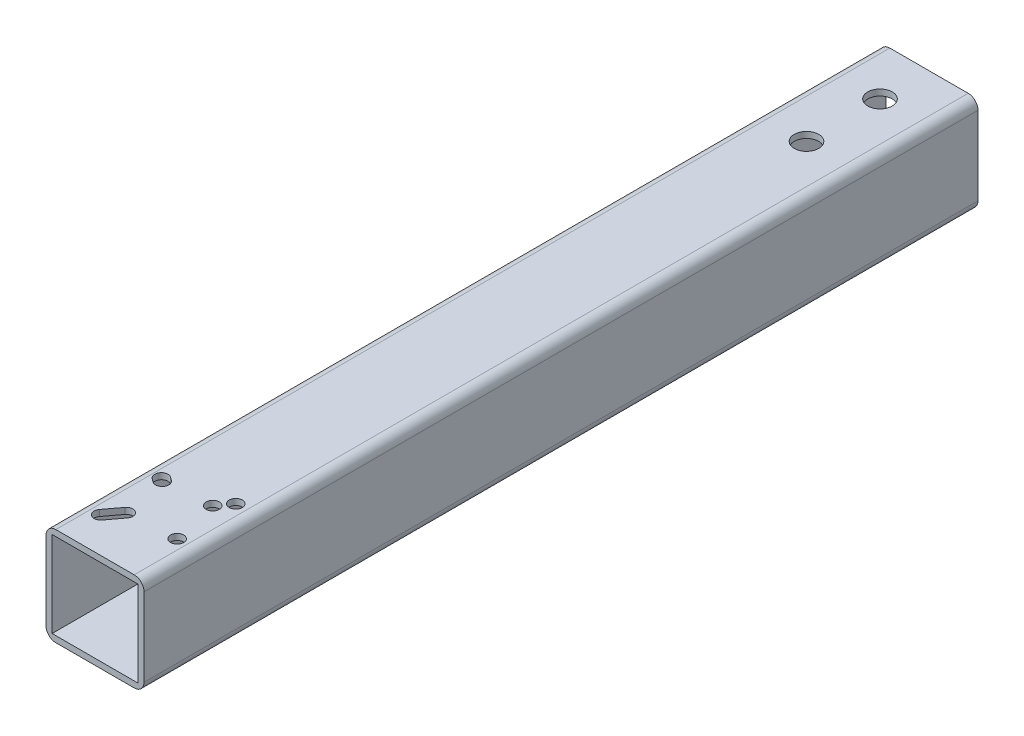
ISO-10303-21;
HEADER;
FILE_DESCRIPTION(('STEP AP214'),'2;1');
FILE_NAME('part.step','',(''),(''),'','','');
FILE_SCHEMA(('AUTOMOTIVE_DESIGN { 1 0 10303 214 1 1 1 1 }'));
ENDSEC;
DATA;
#1=APPLICATION_CONTEXT('core data for automotive mechanical design processes');
#2=APPLICATION_PROTOCOL_DEFINITION('international standard','automotive_design',2000,#1);
#3=PRODUCT_CONTEXT('',#1,'mechanical');
#4=PRODUCT('Part','Part','',(#3));
#5=PRODUCT_RELATED_PRODUCT_CATEGORY('part','',(#4));
#6=PRODUCT_DEFINITION_FORMATION('','',#4);
#7=PRODUCT_DEFINITION_CONTEXT('part definition',#1,'design');
#8=PRODUCT_DEFINITION('design','',#6,#7);
#9=PRODUCT_DEFINITION_SHAPE('','',#8);
#10=(LENGTH_UNIT() NAMED_UNIT(*) SI_UNIT(.MILLI.,.METRE.));
#11=(NAMED_UNIT(*) PLANE_ANGLE_UNIT() SI_UNIT($,.RADIAN.));
#12=(NAMED_UNIT(*) SI_UNIT($,.STERADIAN.) SOLID_ANGLE_UNIT());
#13=UNCERTAINTY_MEASURE_WITH_UNIT(LENGTH_MEASURE(1.E-05),#10,'distance_accuracy_value','');
#14=(GEOMETRIC_REPRESENTATION_CONTEXT(3) GLOBAL_UNCERTAINTY_ASSIGNED_CONTEXT((#13)) GLOBAL_UNIT_ASSIGNED_CONTEXT((#10,
#11,#12)) REPRESENTATION_CONTEXT('',''));
#15=CARTESIAN_POINT('',(0.,0.,0.));
#16=DIRECTION('',(0.,0.,1.));
#17=DIRECTION('',(1.,0.,0.));
#18=AXIS2_PLACEMENT_3D('',#15,#16,#17);
#19=CARTESIAN_POINT('',(0.,0.,216.154));
#20=DIRECTION('',(0.,0.,1.));
#21=DIRECTION('',(1.,0.,0.));
#22=AXIS2_PLACEMENT_3D('',#19,#20,#21);
#23=PLANE('',#22);
#24=DIRECTION('',(1.,0.,0.));
#25=VECTOR('',#24,1.);
#26=CARTESIAN_POINT('',(-24.2595918367347,-13.9751836734694,216.154));
#27=LINE('',#26,#25);
#28=CARTESIAN_POINT('',(-21.7195918367347,-13.9751836734694,216.154));
#29=VERTEX_POINT('',#28);
#30=CARTESIAN_POINT('',(-1.39959183673471,-13.9751836734694,216.154));
#31=VERTEX_POINT('',#30);
#32=EDGE_CURVE('E282',#29,#31,#27,.T.);
#33=ORIENTED_EDGE('',*,*,#32,.T.);
#34=CARTESIAN_POINT('',(-1.3995918367347,-11.4351836734694,216.154));
#35=DIRECTION('',(0.,0.,1.));
#36=DIRECTION('',(1.,0.,0.));
#37=AXIS2_PLACEMENT_3D('',#34,#35,#36);
#38=CIRCLE('',#37,2.54);
#39=CARTESIAN_POINT('',(1.1404081632653,-11.4351836734694,216.154));
#40=VERTEX_POINT('',#39);
#41=EDGE_CURVE('E326',#31,#40,#38,.T.);
#42=ORIENTED_EDGE('',*,*,#41,.T.);
#43=DIRECTION('',(0.,1.,0.));
#44=VECTOR('',#43,1.);
#45=CARTESIAN_POINT('',(1.1404081632653,11.4248163265306,216.154));
#46=LINE('',#45,#44);
#47=CARTESIAN_POINT('',(1.1404081632653,8.88481632653061,216.154));
#48=VERTEX_POINT('',#47);
#49=EDGE_CURVE('E286',#40,#48,#46,.T.);
#50=ORIENTED_EDGE('',*,*,#49,.T.);
#51=CARTESIAN_POINT('',(-1.39959183673471,8.88481632653061,216.154));
#52=DIRECTION('',(0.,0.,1.));
#53=DIRECTION('',(1.,0.,0.));
#54=AXIS2_PLACEMENT_3D('',#51,#52,#53);
#55=CIRCLE('',#54,2.54);
#56=CARTESIAN_POINT('',(-1.39959183673471,11.4248163265306,216.154));
#57=VERTEX_POINT('',#56);
#58=EDGE_CURVE('E320',#48,#57,#55,.T.);
#59=ORIENTED_EDGE('',*,*,#58,.T.);
#60=DIRECTION('',(-1.,0.,0.));
#61=VECTOR('',#60,1.);
#62=CARTESIAN_POINT('',(-24.2595918367347,11.4248163265306,216.154));
#63=LINE('',#62,#61);
#64=CARTESIAN_POINT('',(-21.7195918367347,11.4248163265306,216.154));
#65=VERTEX_POINT('',#64);
#66=EDGE_CURVE('E289',#57,#65,#63,.T.);
#67=ORIENTED_EDGE('',*,*,#66,.T.);
#68=CARTESIAN_POINT('',(-21.7195918367347,8.88481632653061,216.154));
#69=DIRECTION('',(0.,0.,1.));
#70=DIRECTION('',(1.,0.,0.));
#71=AXIS2_PLACEMENT_3D('',#68,#69,#70);
#72=CIRCLE('',#71,2.54);
#73=CARTESIAN_POINT('',(-24.2595918367347,8.88481632653061,216.154));
#74=VERTEX_POINT('',#73);
#75=EDGE_CURVE('E322',#65,#74,#72,.T.);
#76=ORIENTED_EDGE('',*,*,#75,.T.);
#77=DIRECTION('',(0.,-1.,0.));
#78=VECTOR('',#77,1.);
#79=CARTESIAN_POINT('',(-24.2595918367347,11.4248163265306,216.154));
#80=LINE('',#79,#78);
#81=CARTESIAN_POINT('',(-24.2595918367347,-11.4351836734694,216.154));
#82=VERTEX_POINT('',#81);
#83=EDGE_CURVE('E279',#74,#82,#80,.T.);
#84=ORIENTED_EDGE('',*,*,#83,.T.);
#85=CARTESIAN_POINT('',(-21.7195918367347,-11.4351836734694,216.154));
#86=DIRECTION('',(0.,0.,1.));
#87=DIRECTION('',(1.,0.,0.));
#88=AXIS2_PLACEMENT_3D('',#85,#86,#87);
#89=CIRCLE('',#88,2.54);
#90=EDGE_CURVE('E324',#82,#29,#89,.T.);
#91=ORIENTED_EDGE('',*,*,#90,.T.);
#92=EDGE_LOOP('',(#33,#42,#50,#59,#67,#76,#84,#91));
#93=FACE_BOUND('',#92,.T.);
#94=DIRECTION('',(1.,0.,0.));
#95=VECTOR('',#94,1.);
#96=CARTESIAN_POINT('',(-22.6720918367347,-12.3876836734694,216.154));
#97=LINE('',#96,#95);
#98=CARTESIAN_POINT('',(-22.6720918367347,-12.3876836734694,216.154));
#99=VERTEX_POINT('',#98);
#100=CARTESIAN_POINT('',(-0.447091836734699,-12.3876836734694,216.154));
#101=VERTEX_POINT('',#100);
#102=EDGE_CURVE('E250',#99,#101,#97,.T.);
#103=ORIENTED_EDGE('',*,*,#102,.F.);
#104=DIRECTION('',(0.,-1.,0.));
#105=VECTOR('',#104,1.);
#106=CARTESIAN_POINT('',(-22.6720918367347,9.83731632653061,216.154));
#107=LINE('',#106,#105);
#108=CARTESIAN_POINT('',(-22.6720918367347,9.83731632653061,216.154));
#109=VERTEX_POINT('',#108);
#110=EDGE_CURVE('E248',#109,#99,#107,.T.);
#111=ORIENTED_EDGE('',*,*,#110,.F.);
#112=DIRECTION('',(-1.,0.,0.));
#113=VECTOR('',#112,1.);
#114=CARTESIAN_POINT('',(-22.6720918367347,9.83731632653061,216.154));
#115=LINE('',#114,#113);
#116=CARTESIAN_POINT('',(-0.447091836734703,9.83731632653061,216.154));
#117=VERTEX_POINT('',#116);
#118=EDGE_CURVE('E256',#117,#109,#115,.T.);
#119=ORIENTED_EDGE('',*,*,#118,.F.);
#120=DIRECTION('',(0.,1.,0.));
#121=VECTOR('',#120,1.);
#122=CARTESIAN_POINT('',(-0.447091836734703,9.83731632653061,216.154));
#123=LINE('',#122,#121);
#124=EDGE_CURVE('E253',#101,#117,#123,.T.);
#125=ORIENTED_EDGE('',*,*,#124,.F.);
#126=EDGE_LOOP('',(#103,#111,#119,#125));
#127=FACE_BOUND('',#126,.T.);
#128=ADVANCED_FACE('F33',(#93,#127),#23,.T.);
#129=CARTESIAN_POINT('',(0.,0.,0.));
#130=DIRECTION('',(0.,0.,1.));
#131=DIRECTION('',(1.,0.,0.));
#132=AXIS2_PLACEMENT_3D('',#129,#130,#131);
#133=PLANE('',#132);
#134=DIRECTION('',(0.,1.,0.));
#135=VECTOR('',#134,1.);
#136=CARTESIAN_POINT('',(1.1404081632653,11.4248163265306,0.));
#137=LINE('',#136,#135);
#138=CARTESIAN_POINT('',(1.1404081632653,-11.4351836734694,0.));
#139=VERTEX_POINT('',#138);
#140=CARTESIAN_POINT('',(1.1404081632653,8.88481632653061,0.));
#141=VERTEX_POINT('',#140);
#142=EDGE_CURVE('E298',#139,#141,#137,.T.);
#143=ORIENTED_EDGE('',*,*,#142,.F.);
#144=CARTESIAN_POINT('',(-1.3995918367347,-11.4351836734694,0.));
#145=DIRECTION('',(0.,0.,1.));
#146=DIRECTION('',(1.,0.,0.));
#147=AXIS2_PLACEMENT_3D('',#144,#145,#146);
#148=CIRCLE('',#147,2.54);
#149=CARTESIAN_POINT('',(-1.39959183673471,-13.9751836734694,0.));
#150=VERTEX_POINT('',#149);
#151=EDGE_CURVE('E313',#139,#150,#148,.F.);
#152=ORIENTED_EDGE('',*,*,#151,.T.);
#153=DIRECTION('',(1.,0.,0.));
#154=VECTOR('',#153,1.);
#155=CARTESIAN_POINT('',(-24.2595918367347,-13.9751836734694,0.));
#156=LINE('',#155,#154);
#157=CARTESIAN_POINT('',(-21.7195918367347,-13.9751836734694,0.));
#158=VERTEX_POINT('',#157);
#159=EDGE_CURVE('E295',#158,#150,#156,.T.);
#160=ORIENTED_EDGE('',*,*,#159,.F.);
#161=CARTESIAN_POINT('',(-21.7195918367347,-11.4351836734694,0.));
#162=DIRECTION('',(0.,0.,1.));
#163=DIRECTION('',(1.,0.,0.));
#164=AXIS2_PLACEMENT_3D('',#161,#162,#163);
#165=CIRCLE('',#164,2.54);
#166=CARTESIAN_POINT('',(-24.2595918367347,-11.4351836734694,0.));
#167=VERTEX_POINT('',#166);
#168=EDGE_CURVE('E311',#158,#167,#165,.F.);
#169=ORIENTED_EDGE('',*,*,#168,.T.);
#170=DIRECTION('',(0.,-1.,0.));
#171=VECTOR('',#170,1.);
#172=CARTESIAN_POINT('',(-24.2595918367347,11.4248163265306,0.));
#173=LINE('',#172,#171);
#174=CARTESIAN_POINT('',(-24.2595918367347,8.88481632653061,0.));
#175=VERTEX_POINT('',#174);
#176=EDGE_CURVE('E278',#175,#167,#173,.T.);
#177=ORIENTED_EDGE('',*,*,#176,.F.);
#178=CARTESIAN_POINT('',(-21.7195918367347,8.88481632653061,0.));
#179=DIRECTION('',(0.,0.,1.));
#180=DIRECTION('',(1.,0.,0.));
#181=AXIS2_PLACEMENT_3D('',#178,#179,#180);
#182=CIRCLE('',#181,2.54);
#183=CARTESIAN_POINT('',(-21.7195918367347,11.4248163265306,0.));
#184=VERTEX_POINT('',#183);
#185=EDGE_CURVE('E309',#175,#184,#182,.F.);
#186=ORIENTED_EDGE('',*,*,#185,.T.);
#187=DIRECTION('',(-1.,0.,0.));
#188=VECTOR('',#187,1.);
#189=CARTESIAN_POINT('',(-24.2595918367347,11.4248163265306,0.));
#190=LINE('',#189,#188);
#191=CARTESIAN_POINT('',(-1.39959183673471,11.4248163265306,0.));
#192=VERTEX_POINT('',#191);
#193=EDGE_CURVE('E283',#192,#184,#190,.T.);
#194=ORIENTED_EDGE('',*,*,#193,.F.);
#195=CARTESIAN_POINT('',(-1.39959183673471,8.88481632653061,0.));
#196=DIRECTION('',(0.,0.,1.));
#197=DIRECTION('',(1.,0.,0.));
#198=AXIS2_PLACEMENT_3D('',#195,#196,#197);
#199=CIRCLE('',#198,2.54);
#200=EDGE_CURVE('E307',#192,#141,#199,.F.);
#201=ORIENTED_EDGE('',*,*,#200,.T.);
#202=EDGE_LOOP('',(#143,#152,#160,#169,#177,#186,#194,#201));
#203=FACE_BOUND('',#202,.T.);
#204=DIRECTION('',(0.,-1.,0.));
#205=VECTOR('',#204,1.);
#206=CARTESIAN_POINT('',(-22.6720918367347,9.83731632653061,0.));
#207=LINE('',#206,#205);
#208=CARTESIAN_POINT('',(-22.6720918367347,9.83731632653061,0.));
#209=VERTEX_POINT('',#208);
#210=CARTESIAN_POINT('',(-22.6720918367347,-12.3876836734694,0.));
#211=VERTEX_POINT('',#210);
#212=EDGE_CURVE('E247',#209,#211,#207,.T.);
#213=ORIENTED_EDGE('',*,*,#212,.T.);
#214=DIRECTION('',(1.,0.,0.));
#215=VECTOR('',#214,1.);
#216=CARTESIAN_POINT('',(-22.6720918367347,-12.3876836734694,0.));
#217=LINE('',#216,#215);
#218=CARTESIAN_POINT('',(-0.447091836734699,-12.3876836734694,0.));
#219=VERTEX_POINT('',#218);
#220=EDGE_CURVE('E261',#211,#219,#217,.T.);
#221=ORIENTED_EDGE('',*,*,#220,.T.);
#222=DIRECTION('',(0.,1.,0.));
#223=VECTOR('',#222,1.);
#224=CARTESIAN_POINT('',(-0.447091836734703,9.83731632653061,0.));
#225=LINE('',#224,#223);
#226=CARTESIAN_POINT('',(-0.447091836734703,9.83731632653061,0.));
#227=VERTEX_POINT('',#226);
#228=EDGE_CURVE('E264',#219,#227,#225,.T.);
#229=ORIENTED_EDGE('',*,*,#228,.T.);
#230=DIRECTION('',(-1.,0.,0.));
#231=VECTOR('',#230,1.);
#232=CARTESIAN_POINT('',(-22.6720918367347,9.83731632653061,0.));
#233=LINE('',#232,#231);
#234=EDGE_CURVE('E251',#227,#209,#233,.T.);
#235=ORIENTED_EDGE('',*,*,#234,.T.);
#236=EDGE_LOOP('',(#213,#221,#229,#235));
#237=FACE_BOUND('',#236,.T.);
#238=ADVANCED_FACE('F389',(#203,#237),#133,.F.);
#239=CARTESIAN_POINT('',(-24.2595918367347,11.4248163265306,216.154));
#240=DIRECTION('',(1.,0.,0.));
#241=DIRECTION('',(0.,0.,-1.));
#242=AXIS2_PLACEMENT_3D('',#239,#240,#241);
#243=PLANE('',#242);
#244=ORIENTED_EDGE('',*,*,#176,.T.);
#245=DIRECTION('',(0.,0.,-1.));
#246=VECTOR('',#245,1.);
#247=CARTESIAN_POINT('',(-24.2595918367347,-11.4351836734694,216.154));
#248=LINE('',#247,#246);
#249=EDGE_CURVE('E331',#167,#82,#248,.F.);
#250=ORIENTED_EDGE('',*,*,#249,.T.);
#251=ORIENTED_EDGE('',*,*,#83,.F.);
#252=DIRECTION('',(0.,0.,-1.));
#253=VECTOR('',#252,1.);
#254=CARTESIAN_POINT('',(-24.2595918367347,8.88481632653061,216.154));
#255=LINE('',#254,#253);
#256=EDGE_CURVE('E328',#74,#175,#255,.T.);
#257=ORIENTED_EDGE('',*,*,#256,.T.);
#258=EDGE_LOOP('',(#244,#250,#251,#257));
#259=FACE_BOUND('',#258,.T.);
#260=ADVANCED_FACE('F395',(#259),#243,.F.);
#261=CARTESIAN_POINT('',(-24.2595918367347,-13.9751836734694,216.154));
#262=DIRECTION('',(0.,1.,0.));
#263=DIRECTION('',(0.,0.,1.));
#264=AXIS2_PLACEMENT_3D('',#261,#262,#263);
#265=PLANE('',#264);
#266=CARTESIAN_POINT('',(-11.5595918367347,-13.9751836734694,31.75));
#267=DIRECTION('',(0.,1.,0.));
#268=DIRECTION('',(0.,0.,1.));
#269=AXIS2_PLACEMENT_3D('',#266,#267,#268);
#270=CIRCLE('',#269,3.175);
#271=CARTESIAN_POINT('',(-11.5595918367347,-13.9751836734694,34.925));
#272=VERTEX_POINT('',#271);
#273=EDGE_CURVE('E227',#272,#272,#270,.T.);
#274=ORIENTED_EDGE('',*,*,#273,.T.);
#275=EDGE_LOOP('',(#274));
#276=FACE_BOUND('',#275,.T.);
#277=CARTESIAN_POINT('',(-11.5595918367347,-13.9751836734694,12.7));
#278=DIRECTION('',(0.,1.,0.));
#279=DIRECTION('',(0.,0.,1.));
#280=AXIS2_PLACEMENT_3D('',#277,#278,#279);
#281=CIRCLE('',#280,3.175);
#282=CARTESIAN_POINT('',(-11.5595918367347,-13.9751836734694,15.875));
#283=VERTEX_POINT('',#282);
#284=EDGE_CURVE('E238',#283,#283,#281,.T.);
#285=ORIENTED_EDGE('',*,*,#284,.T.);
#286=EDGE_LOOP('',(#285));
#287=FACE_BOUND('',#286,.T.);
#288=ORIENTED_EDGE('',*,*,#159,.T.);
#289=DIRECTION('',(0.,0.,-1.));
#290=VECTOR('',#289,1.);
#291=CARTESIAN_POINT('',(-1.3995918367347,-13.9751836734694,216.154));
#292=LINE('',#291,#290);
#293=EDGE_CURVE('E318',#150,#31,#292,.F.);
#294=ORIENTED_EDGE('',*,*,#293,.T.);
#295=ORIENTED_EDGE('',*,*,#32,.F.);
#296=DIRECTION('',(0.,0.,-1.));
#297=VECTOR('',#296,1.);
#298=CARTESIAN_POINT('',(-21.7195918367347,-13.9751836734694,216.154));
#299=LINE('',#298,#297);
#300=EDGE_CURVE('E315',#29,#158,#299,.T.);
#301=ORIENTED_EDGE('',*,*,#300,.T.);
#302=EDGE_LOOP('',(#288,#294,#295,#301));
#303=FACE_BOUND('',#302,.T.);
#304=ADVANCED_FACE('F384',(#276,#287,#303),#265,.F.);
#305=CARTESIAN_POINT('',(1.1404081632653,11.4248163265306,216.154));
#306=DIRECTION('',(-1.,0.,0.));
#307=DIRECTION('',(0.,-1.,0.));
#308=AXIS2_PLACEMENT_3D('',#305,#306,#307);
#309=PLANE('',#308);
#310=ORIENTED_EDGE('',*,*,#49,.F.);
#311=DIRECTION('',(0.,0.,-1.));
#312=VECTOR('',#311,1.);
#313=CARTESIAN_POINT('',(1.1404081632653,-11.4351836734694,216.154));
#314=LINE('',#313,#312);
#315=EDGE_CURVE('E304',#40,#139,#314,.T.);
#316=ORIENTED_EDGE('',*,*,#315,.T.);
#317=ORIENTED_EDGE('',*,*,#142,.T.);
#318=DIRECTION('',(0.,0.,-1.));
#319=VECTOR('',#318,1.);
#320=CARTESIAN_POINT('',(1.1404081632653,8.88481632653061,216.154));
#321=LINE('',#320,#319);
#322=EDGE_CURVE('E292',#141,#48,#321,.F.);
#323=ORIENTED_EDGE('',*,*,#322,.T.);
#324=EDGE_LOOP('',(#310,#316,#317,#323));
#325=FACE_BOUND('',#324,.T.);
#326=ADVANCED_FACE('F374',(#325),#309,.F.);
#327=CARTESIAN_POINT('',(-24.2595918367347,11.4248163265306,216.154));
#328=DIRECTION('',(0.,-1.,0.));
#329=DIRECTION('',(0.,0.,-1.));
#330=AXIS2_PLACEMENT_3D('',#327,#328,#329);
#331=PLANE('',#330);
#332=CARTESIAN_POINT('',(-4.1721462690021,11.4248163265306,187.046528614338));
#333=DIRECTION('',(0.,1.,0.));
#334=DIRECTION('',(0.,0.,1.));
#335=AXIS2_PLACEMENT_3D('',#332,#333,#334);
#336=CIRCLE('',#335,1.70000000000007);
#337=CARTESIAN_POINT('',(-4.1721462690021,11.4248163265306,188.746528614338));
#338=VERTEX_POINT('',#337);
#339=EDGE_CURVE('E358',#338,#338,#336,.T.);
#340=ORIENTED_EDGE('',*,*,#339,.F.);
#341=EDGE_LOOP('',(#340));
#342=FACE_BOUND('',#341,.T.);
#343=CARTESIAN_POINT('',(-3.92199462296425,11.4248163265306,202.499522882528));
#344=DIRECTION('',(0.,1.,0.));
#345=DIRECTION('',(0.,0.,1.));
#346=AXIS2_PLACEMENT_3D('',#343,#344,#345);
#347=CIRCLE('',#346,1.69999999999941);
#348=CARTESIAN_POINT('',(-3.92199462296425,11.4248163265306,204.199522882527));
#349=VERTEX_POINT('',#348);
#350=EDGE_CURVE('E202',#349,#349,#347,.T.);
#351=ORIENTED_EDGE('',*,*,#350,.F.);
#352=EDGE_LOOP('',(#351));
#353=FACE_BOUND('',#352,.T.);
#354=DIRECTION('',(-0.601815023152091,0.,0.798635510047261));
#355=VECTOR('',#354,1.);
#356=CARTESIAN_POINT('',(-17.7317923890318,11.4248163265306,202.21599854102));
#357=LINE('',#356,#355);
#358=CARTESIAN_POINT('',(-17.7317923890318,11.4248163265306,202.21599854102));
#359=VERTEX_POINT('',#358);
#360=CARTESIAN_POINT('',(-20.5752022148845,11.4248163265306,205.989330826162));
#361=VERTEX_POINT('',#360);
#362=EDGE_CURVE('E188',#359,#361,#357,.T.);
#363=ORIENTED_EDGE('',*,*,#362,.F.);
#364=CARTESIAN_POINT('',(-16.3741120219513,11.4248163265306,203.239084080378));
#365=DIRECTION('',(0.,1.,0.));
#366=DIRECTION('',(0.,0.,1.));
#367=AXIS2_PLACEMENT_3D('',#364,#365,#366);
#368=CIRCLE('',#367,1.70000000000002);
#369=CARTESIAN_POINT('',(-15.016431654871,11.4248163265306,204.262169619737));
#370=VERTEX_POINT('',#369);
#371=EDGE_CURVE('E50',#370,#359,#368,.T.);
#372=ORIENTED_EDGE('',*,*,#371,.F.);
#373=DIRECTION('',(0.601815023152079,0.,-0.79863551004727));
#374=VECTOR('',#373,1.);
#375=CARTESIAN_POINT('',(-15.016431654871,11.4248163265306,204.262169619737));
#376=LINE('',#375,#374);
#377=CARTESIAN_POINT('',(-17.8598414807237,11.4248163265306,208.035501904879));
#378=VERTEX_POINT('',#377);
#379=EDGE_CURVE('E195',#378,#370,#376,.T.);
#380=ORIENTED_EDGE('',*,*,#379,.F.);
#381=CARTESIAN_POINT('',(-19.217521847804,11.4248163265306,207.01241636552));
#382=DIRECTION('',(0.,1.,0.));
#383=DIRECTION('',(0.,0.,1.));
#384=AXIS2_PLACEMENT_3D('',#381,#382,#383);
#385=CIRCLE('',#384,1.70000000000006);
#386=EDGE_CURVE('E178',#361,#378,#385,.T.);
#387=ORIENTED_EDGE('',*,*,#386,.F.);
#388=EDGE_LOOP('',(#363,#372,#380,#387));
#389=FACE_BOUND('',#388,.T.);
#390=DIRECTION('',(0.803957601449481,0.,0.594686619213512));
#391=VECTOR('',#390,1.);
#392=CARTESIAN_POINT('',(-20.6165667647041,11.4248163265306,192.265104237375));
#393=LINE('',#392,#391);
#394=CARTESIAN_POINT('',(-20.6165667647041,11.4248163265306,192.265104237375));
#395=VERTEX_POINT('',#394);
#396=CARTESIAN_POINT('',(-19.7997458416314,11.4248163265306,192.869305842496));
#397=VERTEX_POINT('',#396);
#398=EDGE_CURVE('E206',#395,#397,#393,.T.);
#399=ORIENTED_EDGE('',*,*,#398,.F.);
#400=CARTESIAN_POINT('',(-19.6055995120411,11.4248163265306,190.898376314911));
#401=DIRECTION('',(0.,1.,0.));
#402=DIRECTION('',(0.,0.,1.));
#403=AXIS2_PLACEMENT_3D('',#400,#401,#402);
#404=CIRCLE('',#403,1.69999999999998);
#405=CARTESIAN_POINT('',(-18.5946322593782,11.4248163265306,189.531648392447));
#406=VERTEX_POINT('',#405);
#407=EDGE_CURVE('E58',#406,#395,#404,.T.);
#408=ORIENTED_EDGE('',*,*,#407,.F.);
#409=DIRECTION('',(-0.803957601449509,0.,-0.594686619213475));
#410=VECTOR('',#409,1.);
#411=CARTESIAN_POINT('',(-18.5946322593782,11.4248163265306,189.531648392447));
#412=LINE('',#411,#410);
#413=CARTESIAN_POINT('',(-17.7778113363054,11.4248163265306,190.135849997568));
#414=VERTEX_POINT('',#413);
#415=EDGE_CURVE('E212',#414,#406,#412,.T.);
#416=ORIENTED_EDGE('',*,*,#415,.F.);
#417=CARTESIAN_POINT('',(-18.7887785889684,11.4248163265306,191.502577920032));
#418=DIRECTION('',(0.,1.,0.));
#419=DIRECTION('',(0.,0.,1.));
#420=AXIS2_PLACEMENT_3D('',#417,#418,#419);
#421=CIRCLE('',#420,1.70000000000001);
#422=EDGE_CURVE('E209',#397,#414,#421,.T.);
#423=ORIENTED_EDGE('',*,*,#422,.F.);
#424=EDGE_LOOP('',(#399,#408,#416,#423));
#425=FACE_BOUND('',#424,.T.);
#426=CARTESIAN_POINT('',(-6.7450716515181,11.4248163265306,190.460915919622));
#427=DIRECTION('',(0.,1.,0.));
#428=DIRECTION('',(0.,0.,1.));
#429=AXIS2_PLACEMENT_3D('',#426,#427,#428);
#430=CIRCLE('',#429,1.70000000000005);
#431=CARTESIAN_POINT('',(-6.7450716515181,11.4248163265306,192.160915919622));
#432=VERTEX_POINT('',#431);
#433=EDGE_CURVE('E223',#432,#432,#430,.T.);
#434=ORIENTED_EDGE('',*,*,#433,.F.);
#435=EDGE_LOOP('',(#434));
#436=FACE_BOUND('',#435,.T.);
#437=CARTESIAN_POINT('',(-11.5595918367347,11.4248163265306,31.75));
#438=DIRECTION('',(0.,1.,0.));
#439=DIRECTION('',(0.,0.,1.));
#440=AXIS2_PLACEMENT_3D('',#437,#438,#439);
#441=CIRCLE('',#440,3.175);
#442=CARTESIAN_POINT('',(-11.5595918367347,11.4248163265306,34.925));
#443=VERTEX_POINT('',#442);
#444=EDGE_CURVE('E231',#443,#443,#441,.T.);
#445=ORIENTED_EDGE('',*,*,#444,.F.);
#446=EDGE_LOOP('',(#445));
#447=FACE_BOUND('',#446,.T.);
#448=CARTESIAN_POINT('',(-11.5595918367347,11.4248163265306,12.7));
#449=DIRECTION('',(0.,1.,0.));
#450=DIRECTION('',(0.,0.,1.));
#451=AXIS2_PLACEMENT_3D('',#448,#449,#450);
#452=CIRCLE('',#451,3.175);
#453=CARTESIAN_POINT('',(-11.5595918367347,11.4248163265306,15.875));
#454=VERTEX_POINT('',#453);
#455=EDGE_CURVE('E237',#454,#454,#452,.T.);
#456=ORIENTED_EDGE('',*,*,#455,.F.);
#457=EDGE_LOOP('',(#456));
#458=FACE_BOUND('',#457,.T.);
#459=ORIENTED_EDGE('',*,*,#193,.T.);
#460=DIRECTION('',(0.,0.,-1.));
#461=VECTOR('',#460,1.);
#462=CARTESIAN_POINT('',(-21.7195918367347,11.4248163265306,216.154));
#463=LINE('',#462,#461);
#464=EDGE_CURVE('E336',#184,#65,#463,.F.);
#465=ORIENTED_EDGE('',*,*,#464,.T.);
#466=ORIENTED_EDGE('',*,*,#66,.F.);
#467=DIRECTION('',(0.,0.,-1.));
#468=VECTOR('',#467,1.);
#469=CARTESIAN_POINT('',(-1.39959183673471,11.4248163265306,216.154));
#470=LINE('',#469,#468);
#471=EDGE_CURVE('E333',#57,#192,#470,.T.);
#472=ORIENTED_EDGE('',*,*,#471,.T.);
#473=EDGE_LOOP('',(#459,#465,#466,#472));
#474=FACE_BOUND('',#473,.T.);
#475=ADVANCED_FACE('F192',(#342,#353,#389,#425,#436,#447,#458,#474),#331,.F.);
#476=CARTESIAN_POINT('',(-22.6720918367347,9.83731632653061,216.154));
#477=DIRECTION('',(1.,0.,0.));
#478=DIRECTION('',(0.,1.,0.));
#479=AXIS2_PLACEMENT_3D('',#476,#477,#478);
#480=PLANE('',#479);
#481=ORIENTED_EDGE('',*,*,#212,.F.);
#482=DIRECTION('',(0.,0.,-1.));
#483=VECTOR('',#482,1.);
#484=CARTESIAN_POINT('',(-22.6720918367347,9.83731632653061,216.154));
#485=LINE('',#484,#483);
#486=EDGE_CURVE('E258',#109,#209,#485,.T.);
#487=ORIENTED_EDGE('',*,*,#486,.F.);
#488=ORIENTED_EDGE('',*,*,#110,.T.);
#489=DIRECTION('',(0.,0.,-1.));
#490=VECTOR('',#489,1.);
#491=CARTESIAN_POINT('',(-22.6720918367347,-12.3876836734694,216.154));
#492=LINE('',#491,#490);
#493=EDGE_CURVE('E275',#99,#211,#492,.T.);
#494=ORIENTED_EDGE('',*,*,#493,.T.);
#495=EDGE_LOOP('',(#481,#487,#488,#494));
#496=FACE_BOUND('',#495,.T.);
#497=ADVANCED_FACE('F373',(#496),#480,.T.);
#498=CARTESIAN_POINT('',(-22.6720918367347,-12.3876836734694,216.154));
#499=DIRECTION('',(0.,1.,0.));
#500=DIRECTION('',(0.,0.,1.));
#501=AXIS2_PLACEMENT_3D('',#498,#499,#500);
#502=PLANE('',#501);
#503=CARTESIAN_POINT('',(-11.5595918367347,-12.3876836734694,31.75));
#504=DIRECTION('',(0.,1.,0.));
#505=DIRECTION('',(0.,0.,1.));
#506=AXIS2_PLACEMENT_3D('',#503,#504,#505);
#507=CIRCLE('',#506,3.175);
#508=CARTESIAN_POINT('',(-11.5595918367347,-12.3876836734694,34.925));
#509=VERTEX_POINT('',#508);
#510=EDGE_CURVE('E234',#509,#509,#507,.T.);
#511=ORIENTED_EDGE('',*,*,#510,.F.);
#512=EDGE_LOOP('',(#511));
#513=FACE_BOUND('',#512,.T.);
#514=CARTESIAN_POINT('',(-11.5595918367347,-12.3876836734694,12.7));
#515=DIRECTION('',(0.,1.,0.));
#516=DIRECTION('',(0.,0.,1.));
#517=AXIS2_PLACEMENT_3D('',#514,#515,#516);
#518=CIRCLE('',#517,3.175);
#519=CARTESIAN_POINT('',(-11.5595918367347,-12.3876836734694,15.875));
#520=VERTEX_POINT('',#519);
#521=EDGE_CURVE('E244',#520,#520,#518,.T.);
#522=ORIENTED_EDGE('',*,*,#521,.F.);
#523=EDGE_LOOP('',(#522));
#524=FACE_BOUND('',#523,.T.);
#525=ORIENTED_EDGE('',*,*,#220,.F.);
#526=ORIENTED_EDGE('',*,*,#493,.F.);
#527=ORIENTED_EDGE('',*,*,#102,.T.);
#528=DIRECTION('',(0.,0.,-1.));
#529=VECTOR('',#528,1.);
#530=CARTESIAN_POINT('',(-0.447091836734699,-12.3876836734694,216.154));
#531=LINE('',#530,#529);
#532=EDGE_CURVE('E273',#101,#219,#531,.T.);
#533=ORIENTED_EDGE('',*,*,#532,.T.);
#534=EDGE_LOOP('',(#525,#526,#527,#533));
#535=FACE_BOUND('',#534,.T.);
#536=ADVANCED_FACE('F381',(#513,#524,#535),#502,.T.);
#537=CARTESIAN_POINT('',(-0.447091836734703,9.83731632653061,216.154));
#538=DIRECTION('',(-1.,0.,0.));
#539=DIRECTION('',(0.,-1.,0.));
#540=AXIS2_PLACEMENT_3D('',#537,#538,#539);
#541=PLANE('',#540);
#542=ORIENTED_EDGE('',*,*,#228,.F.);
#543=ORIENTED_EDGE('',*,*,#532,.F.);
#544=ORIENTED_EDGE('',*,*,#124,.T.);
#545=DIRECTION('',(0.,0.,-1.));
#546=VECTOR('',#545,1.);
#547=CARTESIAN_POINT('',(-0.447091836734703,9.83731632653061,216.154));
#548=LINE('',#547,#546);
#549=EDGE_CURVE('E271',#117,#227,#548,.T.);
#550=ORIENTED_EDGE('',*,*,#549,.T.);
#551=EDGE_LOOP('',(#542,#543,#544,#550));
#552=FACE_BOUND('',#551,.T.);
#553=ADVANCED_FACE('F401',(#552),#541,.T.);
#554=CARTESIAN_POINT('',(-22.6720918367347,9.83731632653061,216.154));
#555=DIRECTION('',(0.,-1.,0.));
#556=DIRECTION('',(0.,0.,-1.));
#557=AXIS2_PLACEMENT_3D('',#554,#555,#556);
#558=PLANE('',#557);
#559=CARTESIAN_POINT('',(-4.1721462690021,9.83731632653061,187.046528614338));
#560=DIRECTION('',(0.,-1.,0.));
#561=DIRECTION('',(0.,0.,-1.));
#562=AXIS2_PLACEMENT_3D('',#559,#560,#561);
#563=CIRCLE('',#562,1.70000000000007);
#564=CARTESIAN_POINT('',(-4.1721462690021,9.83731632653061,185.346528614338));
#565=VERTEX_POINT('',#564);
#566=EDGE_CURVE('E37',#565,#565,#563,.T.);
#567=ORIENTED_EDGE('',*,*,#566,.F.);
#568=EDGE_LOOP('',(#567));
#569=FACE_BOUND('',#568,.T.);
#570=CARTESIAN_POINT('',(-3.92199462296425,9.83731632653061,202.499522882528));
#571=DIRECTION('',(0.,-1.,0.));
#572=DIRECTION('',(0.,0.,-1.));
#573=AXIS2_PLACEMENT_3D('',#570,#571,#572);
#574=CIRCLE('',#573,1.69999999999941);
#575=CARTESIAN_POINT('',(-3.92199462296425,9.83731632653061,200.799522882528));
#576=VERTEX_POINT('',#575);
#577=EDGE_CURVE('E356',#576,#576,#574,.T.);
#578=ORIENTED_EDGE('',*,*,#577,.F.);
#579=EDGE_LOOP('',(#578));
#580=FACE_BOUND('',#579,.T.);
#581=CARTESIAN_POINT('',(-16.3741120219513,9.83731632653061,203.239084080378));
#582=DIRECTION('',(0.,-1.,0.));
#583=DIRECTION('',(0.,0.,-1.));
#584=AXIS2_PLACEMENT_3D('',#581,#582,#583);
#585=CIRCLE('',#584,1.70000000000002);
#586=CARTESIAN_POINT('',(-17.7317923890318,9.83731632653061,202.21599854102));
#587=VERTEX_POINT('',#586);
#588=CARTESIAN_POINT('',(-15.016431654871,9.83731632653061,204.262169619737));
#589=VERTEX_POINT('',#588);
#590=EDGE_CURVE('E11',#587,#589,#585,.T.);
#591=ORIENTED_EDGE('',*,*,#590,.F.);
#592=DIRECTION('',(0.601815023152091,0.,-0.798635510047261));
#593=VECTOR('',#592,1.);
#594=CARTESIAN_POINT('',(-26.2201100347543,9.83731632653061,213.480376517044));
#595=LINE('',#594,#593);
#596=CARTESIAN_POINT('',(-20.5752022148846,9.83731632653061,205.989330826162));
#597=VERTEX_POINT('',#596);
#598=EDGE_CURVE('E353',#597,#587,#595,.T.);
#599=ORIENTED_EDGE('',*,*,#598,.F.);
#600=CARTESIAN_POINT('',(-19.217521847804,9.83731632653061,207.01241636552));
#601=DIRECTION('',(0.,-1.,0.));
#602=DIRECTION('',(0.,0.,-1.));
#603=AXIS2_PLACEMENT_3D('',#600,#601,#602);
#604=CIRCLE('',#603,1.70000000000006);
#605=CARTESIAN_POINT('',(-17.8598414807237,9.83731632653061,208.035501904879));
#606=VERTEX_POINT('',#605);
#607=EDGE_CURVE('E181',#606,#597,#604,.T.);
#608=ORIENTED_EDGE('',*,*,#607,.F.);
#609=DIRECTION('',(-0.601815023152079,0.,0.79863551004727));
#610=VECTOR('',#609,1.);
#611=CARTESIAN_POINT('',(-23.5047493005935,9.83731632653061,215.526547595761));
#612=LINE('',#611,#610);
#613=EDGE_CURVE('E42',#589,#606,#612,.T.);
#614=ORIENTED_EDGE('',*,*,#613,.F.);
#615=EDGE_LOOP('',(#591,#599,#608,#614));
#616=FACE_BOUND('',#615,.T.);
#617=CARTESIAN_POINT('',(-19.6055995120411,9.83731632653061,190.898376314911));
#618=DIRECTION('',(0.,-1.,0.));
#619=DIRECTION('',(0.,0.,-1.));
#620=AXIS2_PLACEMENT_3D('',#617,#618,#619);
#621=CIRCLE('',#620,1.69999999999998);
#622=CARTESIAN_POINT('',(-20.6165667647041,9.83731632653061,192.265104237375));
#623=VERTEX_POINT('',#622);
#624=CARTESIAN_POINT('',(-18.5946322593782,9.83731632653061,189.531648392447));
#625=VERTEX_POINT('',#624);
#626=EDGE_CURVE('E351',#623,#625,#621,.T.);
#627=ORIENTED_EDGE('',*,*,#626,.F.);
#628=DIRECTION('',(-0.803957601449482,0.,-0.594686619213512));
#629=VECTOR('',#628,1.);
#630=CARTESIAN_POINT('',(-10.5238023022604,9.83731632653061,199.730711833929));
#631=LINE('',#630,#629);
#632=CARTESIAN_POINT('',(-19.7997458416314,9.83731632653061,192.869305842496));
#633=VERTEX_POINT('',#632);
#634=EDGE_CURVE('E338',#633,#623,#631,.T.);
#635=ORIENTED_EDGE('',*,*,#634,.F.);
#636=CARTESIAN_POINT('',(-18.7887785889684,9.83731632653061,191.502577920032));
#637=DIRECTION('',(0.,-1.,0.));
#638=DIRECTION('',(0.,0.,-1.));
#639=AXIS2_PLACEMENT_3D('',#636,#637,#638);
#640=CIRCLE('',#639,1.70000000000001);
#641=CARTESIAN_POINT('',(-17.7778113363054,9.83731632653061,190.135849997568));
#642=VERTEX_POINT('',#641);
#643=EDGE_CURVE('E346',#642,#633,#640,.T.);
#644=ORIENTED_EDGE('',*,*,#643,.F.);
#645=DIRECTION('',(0.803957601449509,0.,0.594686619213475));
#646=VECTOR('',#645,1.);
#647=CARTESIAN_POINT('',(-8.50186779693507,9.83731632653061,196.997255989));
#648=LINE('',#647,#646);
#649=EDGE_CURVE('E349',#625,#642,#648,.T.);
#650=ORIENTED_EDGE('',*,*,#649,.F.);
#651=EDGE_LOOP('',(#627,#635,#644,#650));
#652=FACE_BOUND('',#651,.T.);
#653=CARTESIAN_POINT('',(-6.7450716515181,9.83731632653061,190.460915919622));
#654=DIRECTION('',(0.,-1.,0.));
#655=DIRECTION('',(0.,0.,-1.));
#656=AXIS2_PLACEMENT_3D('',#653,#654,#655);
#657=CIRCLE('',#656,1.70000000000005);
#658=CARTESIAN_POINT('',(-6.7450716515181,9.83731632653061,188.760915919622));
#659=VERTEX_POINT('',#658);
#660=EDGE_CURVE('E226',#659,#659,#657,.T.);
#661=ORIENTED_EDGE('',*,*,#660,.F.);
#662=EDGE_LOOP('',(#661));
#663=FACE_BOUND('',#662,.T.);
#664=CARTESIAN_POINT('',(-11.5595918367347,9.83731632653062,31.75));
#665=DIRECTION('',(0.,-1.,0.));
#666=DIRECTION('',(0.,0.,-1.));
#667=AXIS2_PLACEMENT_3D('',#664,#665,#666);
#668=CIRCLE('',#667,3.175);
#669=CARTESIAN_POINT('',(-11.5595918367347,9.83731632653062,28.575));
#670=VERTEX_POINT('',#669);
#671=EDGE_CURVE('E230',#670,#670,#668,.T.);
#672=ORIENTED_EDGE('',*,*,#671,.F.);
#673=EDGE_LOOP('',(#672));
#674=FACE_BOUND('',#673,.T.);
#675=CARTESIAN_POINT('',(-11.5595918367347,9.83731632653062,12.7));
#676=DIRECTION('',(0.,-1.,0.));
#677=DIRECTION('',(0.,0.,-1.));
#678=AXIS2_PLACEMENT_3D('',#675,#676,#677);
#679=CIRCLE('',#678,3.175);
#680=CARTESIAN_POINT('',(-11.5595918367347,9.83731632653062,9.525));
#681=VERTEX_POINT('',#680);
#682=EDGE_CURVE('E241',#681,#681,#679,.T.);
#683=ORIENTED_EDGE('',*,*,#682,.F.);
#684=EDGE_LOOP('',(#683));
#685=FACE_BOUND('',#684,.T.);
#686=ORIENTED_EDGE('',*,*,#234,.F.);
#687=ORIENTED_EDGE('',*,*,#549,.F.);
#688=ORIENTED_EDGE('',*,*,#118,.T.);
#689=ORIENTED_EDGE('',*,*,#486,.T.);
#690=EDGE_LOOP('',(#686,#687,#688,#689));
#691=FACE_BOUND('',#690,.T.);
#692=ADVANCED_FACE('F405',(#569,#580,#616,#652,#663,#674,#685,#691),#558,.T.);
#693=CARTESIAN_POINT('',(-1.3995918367347,-11.4351836734694,216.154));
#694=DIRECTION('',(0.,0.,-1.));
#695=DIRECTION('',(-1.,0.,0.));
#696=AXIS2_PLACEMENT_3D('',#693,#694,#695);
#697=CYLINDRICAL_SURFACE('',#696,2.54);
#698=ORIENTED_EDGE('',*,*,#41,.F.);
#699=ORIENTED_EDGE('',*,*,#293,.F.);
#700=ORIENTED_EDGE('',*,*,#151,.F.);
#701=ORIENTED_EDGE('',*,*,#315,.F.);
#702=EDGE_LOOP('',(#698,#699,#700,#701));
#703=FACE_BOUND('',#702,.T.);
#704=ADVANCED_FACE('F409',(#703),#697,.T.);
#705=CARTESIAN_POINT('',(-21.7195918367347,-11.4351836734694,216.154));
#706=DIRECTION('',(0.,0.,-1.));
#707=DIRECTION('',(-1.,0.,0.));
#708=AXIS2_PLACEMENT_3D('',#705,#706,#707);
#709=CYLINDRICAL_SURFACE('',#708,2.54);
#710=ORIENTED_EDGE('',*,*,#90,.F.);
#711=ORIENTED_EDGE('',*,*,#249,.F.);
#712=ORIENTED_EDGE('',*,*,#168,.F.);
#713=ORIENTED_EDGE('',*,*,#300,.F.);
#714=EDGE_LOOP('',(#710,#711,#712,#713));
#715=FACE_BOUND('',#714,.T.);
#716=ADVANCED_FACE('F503',(#715),#709,.T.);
#717=CARTESIAN_POINT('',(-21.7195918367347,8.88481632653061,216.154));
#718=DIRECTION('',(0.,0.,-1.));
#719=DIRECTION('',(-1.,0.,0.));
#720=AXIS2_PLACEMENT_3D('',#717,#718,#719);
#721=CYLINDRICAL_SURFACE('',#720,2.54);
#722=ORIENTED_EDGE('',*,*,#75,.F.);
#723=ORIENTED_EDGE('',*,*,#464,.F.);
#724=ORIENTED_EDGE('',*,*,#185,.F.);
#725=ORIENTED_EDGE('',*,*,#256,.F.);
#726=EDGE_LOOP('',(#722,#723,#724,#725));
#727=FACE_BOUND('',#726,.T.);
#728=ADVANCED_FACE('F495',(#727),#721,.T.);
#729=CARTESIAN_POINT('',(-1.39959183673471,8.88481632653061,216.154));
#730=DIRECTION('',(0.,0.,-1.));
#731=DIRECTION('',(-1.,0.,0.));
#732=AXIS2_PLACEMENT_3D('',#729,#730,#731);
#733=CYLINDRICAL_SURFACE('',#732,2.54);
#734=ORIENTED_EDGE('',*,*,#58,.F.);
#735=ORIENTED_EDGE('',*,*,#322,.F.);
#736=ORIENTED_EDGE('',*,*,#200,.F.);
#737=ORIENTED_EDGE('',*,*,#471,.F.);
#738=EDGE_LOOP('',(#734,#735,#736,#737));
#739=FACE_BOUND('',#738,.T.);
#740=ADVANCED_FACE('F35',(#739),#733,.T.);
#741=CARTESIAN_POINT('',(-11.5595918367347,-13.9751836734694,12.7));
#742=DIRECTION('',(0.,1.,0.));
#743=DIRECTION('',(0.,0.,1.));
#744=AXIS2_PLACEMENT_3D('',#741,#742,#743);
#745=CYLINDRICAL_SURFACE('',#744,3.175);
#746=ORIENTED_EDGE('',*,*,#682,.T.);
#747=EDGE_LOOP('',(#746));
#748=FACE_BOUND('',#747,.T.);
#749=ORIENTED_EDGE('',*,*,#455,.T.);
#750=EDGE_LOOP('',(#749));
#751=FACE_BOUND('',#750,.T.);
#752=ADVANCED_FACE('F411',(#748,#751),#745,.F.);
#753=ORIENTED_EDGE('',*,*,#521,.T.);
#754=EDGE_LOOP('',(#753));
#755=FACE_BOUND('',#754,.T.);
#756=ORIENTED_EDGE('',*,*,#284,.F.);
#757=EDGE_LOOP('',(#756));
#758=FACE_BOUND('',#757,.T.);
#759=ADVANCED_FACE('F414',(#755,#758),#745,.F.);
#760=CARTESIAN_POINT('',(-11.5595918367347,-13.9751836734694,31.75));
#761=DIRECTION('',(0.,1.,0.));
#762=DIRECTION('',(0.,0.,1.));
#763=AXIS2_PLACEMENT_3D('',#760,#761,#762);
#764=CYLINDRICAL_SURFACE('',#763,3.175);
#765=ORIENTED_EDGE('',*,*,#671,.T.);
#766=EDGE_LOOP('',(#765));
#767=FACE_BOUND('',#766,.T.);
#768=ORIENTED_EDGE('',*,*,#444,.T.);
#769=EDGE_LOOP('',(#768));
#770=FACE_BOUND('',#769,.T.);
#771=ADVANCED_FACE('F416',(#767,#770),#764,.F.);
#772=ORIENTED_EDGE('',*,*,#510,.T.);
#773=EDGE_LOOP('',(#772));
#774=FACE_BOUND('',#773,.T.);
#775=ORIENTED_EDGE('',*,*,#273,.F.);
#776=EDGE_LOOP('',(#775));
#777=FACE_BOUND('',#776,.T.);
#778=ADVANCED_FACE('F419',(#774,#777),#764,.F.);
#779=CARTESIAN_POINT('',(-6.7450716515181,8.88481632653061,190.460915919622));
#780=DIRECTION('',(0.,1.,0.));
#781=DIRECTION('',(0.,0.,1.));
#782=AXIS2_PLACEMENT_3D('',#779,#780,#781);
#783=CYLINDRICAL_SURFACE('',#782,1.70000000000005);
#784=ORIENTED_EDGE('',*,*,#660,.T.);
#785=EDGE_LOOP('',(#784));
#786=FACE_BOUND('',#785,.T.);
#787=ORIENTED_EDGE('',*,*,#433,.T.);
#788=EDGE_LOOP('',(#787));
#789=FACE_BOUND('',#788,.T.);
#790=ADVANCED_FACE('F421',(#786,#789),#783,.F.);
#791=CARTESIAN_POINT('',(-19.6055995120411,8.88481632653061,190.898376314911));
#792=DIRECTION('',(0.,1.,0.));
#793=DIRECTION('',(0.,0.,1.));
#794=AXIS2_PLACEMENT_3D('',#791,#792,#793);
#795=CYLINDRICAL_SURFACE('',#794,1.69999999999998);
#796=ORIENTED_EDGE('',*,*,#626,.T.);
#797=DIRECTION('',(0.,1.,0.));
#798=VECTOR('',#797,1.);
#799=CARTESIAN_POINT('',(-18.5946322593782,8.88481632653061,189.531648392447));
#800=LINE('',#799,#798);
#801=EDGE_CURVE('E216',#625,#406,#800,.T.);
#802=ORIENTED_EDGE('',*,*,#801,.T.);
#803=ORIENTED_EDGE('',*,*,#407,.T.);
#804=DIRECTION('',(0.,1.,0.));
#805=VECTOR('',#804,1.);
#806=CARTESIAN_POINT('',(-20.6165667647041,8.88481632653061,192.265104237375));
#807=LINE('',#806,#805);
#808=EDGE_CURVE('E215',#623,#395,#807,.T.);
#809=ORIENTED_EDGE('',*,*,#808,.F.);
#810=EDGE_LOOP('',(#796,#802,#803,#809));
#811=FACE_BOUND('',#810,.T.);
#812=ADVANCED_FACE('F424',(#811),#795,.F.);
#813=CARTESIAN_POINT('',(-18.5946322593782,8.88481632653061,189.531648392447));
#814=DIRECTION('',(0.594686619213475,0.,-0.803957601449509));
#815=DIRECTION('',(-0.803957601449509,0.,-0.594686619213475));
#816=AXIS2_PLACEMENT_3D('',#813,#814,#815);
#817=PLANE('',#816);
#818=ORIENTED_EDGE('',*,*,#649,.T.);
#819=DIRECTION('',(0.,1.,0.));
#820=VECTOR('',#819,1.);
#821=CARTESIAN_POINT('',(-17.7778113363054,8.88481632653061,190.135849997568));
#822=LINE('',#821,#820);
#823=EDGE_CURVE('E218',#642,#414,#822,.T.);
#824=ORIENTED_EDGE('',*,*,#823,.T.);
#825=ORIENTED_EDGE('',*,*,#415,.T.);
#826=ORIENTED_EDGE('',*,*,#801,.F.);
#827=EDGE_LOOP('',(#818,#824,#825,#826));
#828=FACE_BOUND('',#827,.T.);
#829=ADVANCED_FACE('F428',(#828),#817,.F.);
#830=CARTESIAN_POINT('',(-18.7887785889684,8.88481632653061,191.502577920032));
#831=DIRECTION('',(0.,1.,0.));
#832=DIRECTION('',(0.,0.,1.));
#833=AXIS2_PLACEMENT_3D('',#830,#831,#832);
#834=CYLINDRICAL_SURFACE('',#833,1.70000000000001);
#835=ORIENTED_EDGE('',*,*,#643,.T.);
#836=DIRECTION('',(0.,1.,0.));
#837=VECTOR('',#836,1.);
#838=CARTESIAN_POINT('',(-19.7997458416314,8.88481632653061,192.869305842496));
#839=LINE('',#838,#837);
#840=EDGE_CURVE('E220',#633,#397,#839,.T.);
#841=ORIENTED_EDGE('',*,*,#840,.T.);
#842=ORIENTED_EDGE('',*,*,#422,.T.);
#843=ORIENTED_EDGE('',*,*,#823,.F.);
#844=EDGE_LOOP('',(#835,#841,#842,#843));
#845=FACE_BOUND('',#844,.T.);
#846=ADVANCED_FACE('F433',(#845),#834,.F.);
#847=CARTESIAN_POINT('',(-20.6165667647041,8.88481632653061,192.265104237375));
#848=DIRECTION('',(-0.594686619213512,0.,0.803957601449481));
#849=DIRECTION('',(0.803957601449481,0.,0.594686619213512));
#850=AXIS2_PLACEMENT_3D('',#847,#848,#849);
#851=PLANE('',#850);
#852=ORIENTED_EDGE('',*,*,#634,.T.);
#853=ORIENTED_EDGE('',*,*,#808,.T.);
#854=ORIENTED_EDGE('',*,*,#398,.T.);
#855=ORIENTED_EDGE('',*,*,#840,.F.);
#856=EDGE_LOOP('',(#852,#853,#854,#855));
#857=FACE_BOUND('',#856,.T.);
#858=ADVANCED_FACE('F429',(#857),#851,.F.);
#859=CARTESIAN_POINT('',(-16.3741120219513,8.88481632653061,203.239084080378));
#860=DIRECTION('',(0.,1.,0.));
#861=DIRECTION('',(0.,0.,1.));
#862=AXIS2_PLACEMENT_3D('',#859,#860,#861);
#863=CYLINDRICAL_SURFACE('',#862,1.70000000000002);
#864=ORIENTED_EDGE('',*,*,#590,.T.);
#865=DIRECTION('',(0.,1.,0.));
#866=VECTOR('',#865,1.);
#867=CARTESIAN_POINT('',(-15.016431654871,8.88481632653061,204.262169619737));
#868=LINE('',#867,#866);
#869=EDGE_CURVE('E200',#589,#370,#868,.T.);
#870=ORIENTED_EDGE('',*,*,#869,.T.);
#871=ORIENTED_EDGE('',*,*,#371,.T.);
#872=DIRECTION('',(0.,1.,0.));
#873=VECTOR('',#872,1.);
#874=CARTESIAN_POINT('',(-17.7317923890318,8.88481632653061,202.21599854102));
#875=LINE('',#874,#873);
#876=EDGE_CURVE('E185',#587,#359,#875,.T.);
#877=ORIENTED_EDGE('',*,*,#876,.F.);
#878=EDGE_LOOP('',(#864,#870,#871,#877));
#879=FACE_BOUND('',#878,.T.);
#880=ADVANCED_FACE('F432',(#879),#863,.F.);
#881=CARTESIAN_POINT('',(-15.016431654871,8.88481632653061,204.262169619737));
#882=DIRECTION('',(0.79863551004727,0.,0.601815023152079));
#883=DIRECTION('',(0.601815023152079,0.,-0.79863551004727));
#884=AXIS2_PLACEMENT_3D('',#881,#882,#883);
#885=PLANE('',#884);
#886=ORIENTED_EDGE('',*,*,#613,.T.);
#887=DIRECTION('',(0.,1.,0.));
#888=VECTOR('',#887,1.);
#889=CARTESIAN_POINT('',(-17.8598414807237,8.88481632653061,208.035501904879));
#890=LINE('',#889,#888);
#891=EDGE_CURVE('E184',#606,#378,#890,.T.);
#892=ORIENTED_EDGE('',*,*,#891,.T.);
#893=ORIENTED_EDGE('',*,*,#379,.T.);
#894=ORIENTED_EDGE('',*,*,#869,.F.);
#895=EDGE_LOOP('',(#886,#892,#893,#894));
#896=FACE_BOUND('',#895,.T.);
#897=ADVANCED_FACE('F443',(#896),#885,.F.);
#898=CARTESIAN_POINT('',(-19.217521847804,8.88481632653061,207.01241636552));
#899=DIRECTION('',(0.,1.,0.));
#900=DIRECTION('',(0.,0.,1.));
#901=AXIS2_PLACEMENT_3D('',#898,#899,#900);
#902=CYLINDRICAL_SURFACE('',#901,1.70000000000006);
#903=ORIENTED_EDGE('',*,*,#607,.T.);
#904=DIRECTION('',(0.,1.,0.));
#905=VECTOR('',#904,1.);
#906=CARTESIAN_POINT('',(-20.5752022148845,8.88481632653061,205.989330826162));
#907=LINE('',#906,#905);
#908=EDGE_CURVE('E173',#597,#361,#907,.T.);
#909=ORIENTED_EDGE('',*,*,#908,.T.);
#910=ORIENTED_EDGE('',*,*,#386,.T.);
#911=ORIENTED_EDGE('',*,*,#891,.F.);
#912=EDGE_LOOP('',(#903,#909,#910,#911));
#913=FACE_BOUND('',#912,.T.);
#914=ADVANCED_FACE('F175',(#913),#902,.F.);
#915=CARTESIAN_POINT('',(-17.7317923890318,8.88481632653061,202.21599854102));
#916=DIRECTION('',(-0.798635510047261,0.,-0.601815023152091));
#917=DIRECTION('',(-0.601815023152091,0.,0.798635510047261));
#918=AXIS2_PLACEMENT_3D('',#915,#916,#917);
#919=PLANE('',#918);
#920=ORIENTED_EDGE('',*,*,#598,.T.);
#921=ORIENTED_EDGE('',*,*,#876,.T.);
#922=ORIENTED_EDGE('',*,*,#362,.T.);
#923=ORIENTED_EDGE('',*,*,#908,.F.);
#924=EDGE_LOOP('',(#920,#921,#922,#923));
#925=FACE_BOUND('',#924,.T.);
#926=ADVANCED_FACE('F189',(#925),#919,.F.);
#927=CARTESIAN_POINT('',(-3.92199462296425,8.88481632653061,202.499522882528));
#928=DIRECTION('',(0.,1.,0.));
#929=DIRECTION('',(0.,0.,1.));
#930=AXIS2_PLACEMENT_3D('',#927,#928,#929);
#931=CYLINDRICAL_SURFACE('',#930,1.69999999999941);
#932=ORIENTED_EDGE('',*,*,#577,.T.);
#933=EDGE_LOOP('',(#932));
#934=FACE_BOUND('',#933,.T.);
#935=ORIENTED_EDGE('',*,*,#350,.T.);
#936=EDGE_LOOP('',(#935));
#937=FACE_BOUND('',#936,.T.);
#938=ADVANCED_FACE('F370',(#934,#937),#931,.F.);
#939=CARTESIAN_POINT('',(-4.1721462690021,8.88481632653061,187.046528614338));
#940=DIRECTION('',(0.,1.,0.));
#941=DIRECTION('',(0.,0.,1.));
#942=AXIS2_PLACEMENT_3D('',#939,#940,#941);
#943=CYLINDRICAL_SURFACE('',#942,1.70000000000007);
#944=ORIENTED_EDGE('',*,*,#566,.T.);
#945=EDGE_LOOP('',(#944));
#946=FACE_BOUND('',#945,.T.);
#947=ORIENTED_EDGE('',*,*,#339,.T.);
#948=EDGE_LOOP('',(#947));
#949=FACE_BOUND('',#948,.T.);
#950=ADVANCED_FACE('F453',(#946,#949),#943,.F.);
#951=CLOSED_SHELL('',(#128,#238,#260,#304,#326,#475,#497,#536,#553,#692,#704,#716,#728,#740,
#752,#759,#771,#778,#790,#812,#829,#846,#858,#880,#897,#914,#926,#938,#950));
#952=MANIFOLD_SOLID_BREP('B2',#951);
#953=ADVANCED_BREP_SHAPE_REPRESENTATION('',(#18,#952),#14);
#954=SHAPE_DEFINITION_REPRESENTATION(#9,#953);
ENDSEC;
END-ISO-10303-21;
